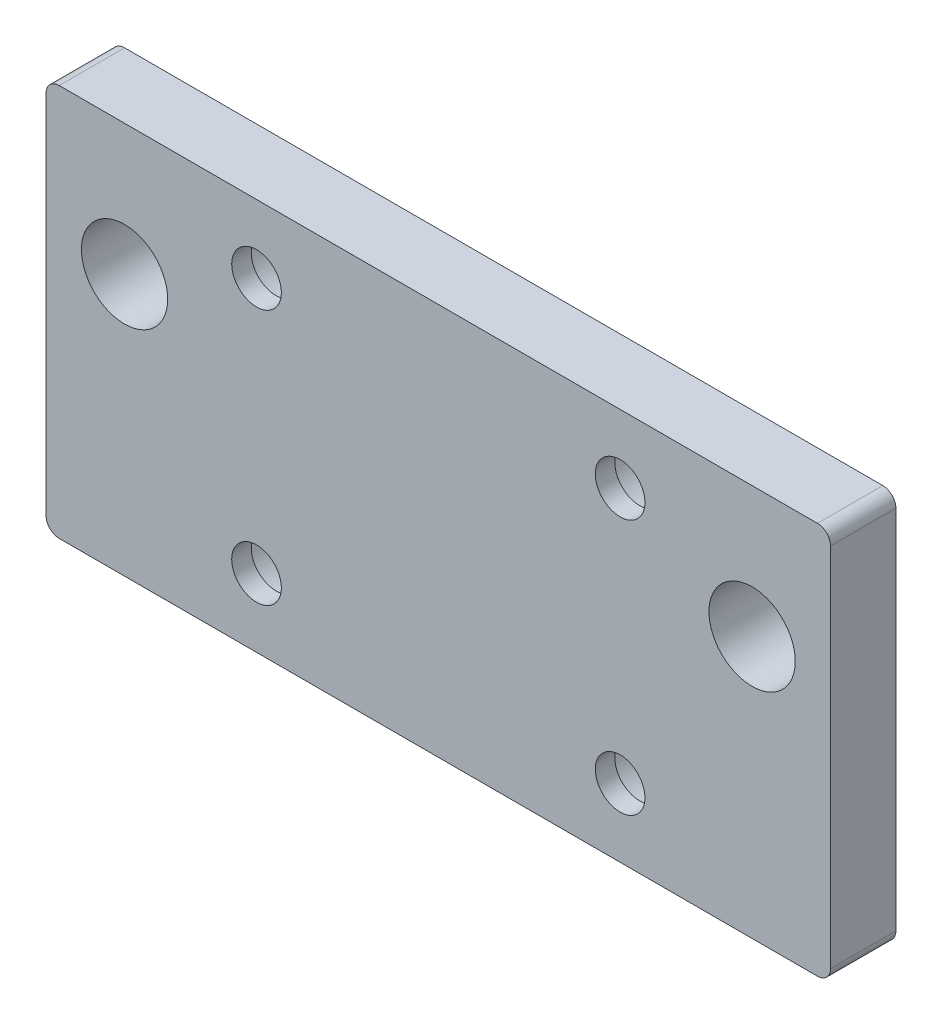
ISO-10303-21;
HEADER;
FILE_DESCRIPTION(('STEP AP214'),'2;1');
FILE_NAME('part.step','',(''),(''),'','','');
FILE_SCHEMA(('AUTOMOTIVE_DESIGN { 1 0 10303 214 1 1 1 1 }'));
ENDSEC;
DATA;
#1=APPLICATION_CONTEXT('core data for automotive mechanical design processes');
#2=APPLICATION_PROTOCOL_DEFINITION('international standard','automotive_design',2000,#1);
#3=PRODUCT_CONTEXT('',#1,'mechanical');
#4=PRODUCT('Part','Part','',(#3));
#5=PRODUCT_RELATED_PRODUCT_CATEGORY('part','',(#4));
#6=PRODUCT_DEFINITION_FORMATION('','',#4);
#7=PRODUCT_DEFINITION_CONTEXT('part definition',#1,'design');
#8=PRODUCT_DEFINITION('design','',#6,#7);
#9=PRODUCT_DEFINITION_SHAPE('','',#8);
#10=(LENGTH_UNIT() NAMED_UNIT(*) SI_UNIT(.MILLI.,.METRE.));
#11=(NAMED_UNIT(*) PLANE_ANGLE_UNIT() SI_UNIT($,.RADIAN.));
#12=(NAMED_UNIT(*) SI_UNIT($,.STERADIAN.) SOLID_ANGLE_UNIT());
#13=UNCERTAINTY_MEASURE_WITH_UNIT(LENGTH_MEASURE(1.E-05),#10,'distance_accuracy_value','');
#14=(GEOMETRIC_REPRESENTATION_CONTEXT(3) GLOBAL_UNCERTAINTY_ASSIGNED_CONTEXT((#13)) GLOBAL_UNIT_ASSIGNED_CONTEXT((#10,
#11,#12)) REPRESENTATION_CONTEXT('',''));
#15=CARTESIAN_POINT('',(0.,0.,0.));
#16=DIRECTION('',(0.,0.,1.));
#17=DIRECTION('',(1.,0.,0.));
#18=AXIS2_PLACEMENT_3D('',#15,#16,#17);
#19=CARTESIAN_POINT('',(0.,0.,5.));
#20=DIRECTION('',(1.,0.,0.));
#21=DIRECTION('',(0.,0.,-1.));
#22=AXIS2_PLACEMENT_3D('',#19,#20,#21);
#23=PLANE('',#22);
#24=DIRECTION('',(0.,-1.,0.));
#25=VECTOR('',#24,1.);
#26=CARTESIAN_POINT('',(0.,0.,0.));
#27=LINE('',#26,#25);
#28=CARTESIAN_POINT('',(0.,29.,0.));
#29=VERTEX_POINT('',#28);
#30=CARTESIAN_POINT('',(0.,1.,0.));
#31=VERTEX_POINT('',#30);
#32=EDGE_CURVE('E158',#29,#31,#27,.T.);
#33=ORIENTED_EDGE('',*,*,#32,.T.);
#34=DIRECTION('',(0.,0.,-1.));
#35=VECTOR('',#34,1.);
#36=CARTESIAN_POINT('',(0.,1.,5.));
#37=LINE('',#36,#35);
#38=CARTESIAN_POINT('',(0.,1.,5.));
#39=VERTEX_POINT('',#38);
#40=EDGE_CURVE('E11',#31,#39,#37,.F.);
#41=ORIENTED_EDGE('',*,*,#40,.T.);
#42=DIRECTION('',(0.,-1.,0.));
#43=VECTOR('',#42,1.);
#44=CARTESIAN_POINT('',(0.,0.,5.));
#45=LINE('',#44,#43);
#46=CARTESIAN_POINT('',(0.,29.,5.));
#47=VERTEX_POINT('',#46);
#48=EDGE_CURVE('E126',#47,#39,#45,.T.);
#49=ORIENTED_EDGE('',*,*,#48,.F.);
#50=DIRECTION('',(0.,0.,-1.));
#51=VECTOR('',#50,1.);
#52=CARTESIAN_POINT('',(0.,29.,5.));
#53=LINE('',#52,#51);
#54=EDGE_CURVE('E42',#47,#29,#53,.T.);
#55=ORIENTED_EDGE('',*,*,#54,.T.);
#56=EDGE_LOOP('',(#33,#41,#49,#55));
#57=FACE_BOUND('',#56,.T.);
#58=ADVANCED_FACE('F34',(#57),#23,.F.);
#59=CARTESIAN_POINT('',(0.,0.,5.));
#60=DIRECTION('',(0.,1.,0.));
#61=DIRECTION('',(0.,0.,1.));
#62=AXIS2_PLACEMENT_3D('',#59,#60,#61);
#63=PLANE('',#62);
#64=DIRECTION('',(1.,0.,0.));
#65=VECTOR('',#64,1.);
#66=CARTESIAN_POINT('',(0.,0.,0.));
#67=LINE('',#66,#65);
#68=CARTESIAN_POINT('',(1.,0.,0.));
#69=VERTEX_POINT('',#68);
#70=CARTESIAN_POINT('',(59.,0.,0.));
#71=VERTEX_POINT('',#70);
#72=EDGE_CURVE('E131',#69,#71,#67,.T.);
#73=ORIENTED_EDGE('',*,*,#72,.T.);
#74=DIRECTION('',(0.,0.,-1.));
#75=VECTOR('',#74,1.);
#76=CARTESIAN_POINT('',(59.,0.,5.));
#77=LINE('',#76,#75);
#78=CARTESIAN_POINT('',(59.,0.,5.));
#79=VERTEX_POINT('',#78);
#80=EDGE_CURVE('E49',#71,#79,#77,.F.);
#81=ORIENTED_EDGE('',*,*,#80,.T.);
#82=DIRECTION('',(1.,0.,0.));
#83=VECTOR('',#82,1.);
#84=CARTESIAN_POINT('',(0.,0.,5.));
#85=LINE('',#84,#83);
#86=CARTESIAN_POINT('',(1.,0.,5.));
#87=VERTEX_POINT('',#86);
#88=EDGE_CURVE('E129',#87,#79,#85,.T.);
#89=ORIENTED_EDGE('',*,*,#88,.F.);
#90=DIRECTION('',(0.,0.,-1.));
#91=VECTOR('',#90,1.);
#92=CARTESIAN_POINT('',(1.,0.,5.));
#93=LINE('',#92,#91);
#94=EDGE_CURVE('E150',#87,#69,#93,.T.);
#95=ORIENTED_EDGE('',*,*,#94,.T.);
#96=EDGE_LOOP('',(#73,#81,#89,#95));
#97=FACE_BOUND('',#96,.T.);
#98=ADVANCED_FACE('F259',(#97),#63,.F.);
#99=CARTESIAN_POINT('',(60.,0.,5.));
#100=DIRECTION('',(-1.,0.,0.));
#101=DIRECTION('',(0.,0.,1.));
#102=AXIS2_PLACEMENT_3D('',#99,#100,#101);
#103=PLANE('',#102);
#104=DIRECTION('',(0.,1.,0.));
#105=VECTOR('',#104,1.);
#106=CARTESIAN_POINT('',(60.,0.,0.));
#107=LINE('',#106,#105);
#108=CARTESIAN_POINT('',(60.,1.,0.));
#109=VERTEX_POINT('',#108);
#110=CARTESIAN_POINT('',(60.,29.,0.));
#111=VERTEX_POINT('',#110);
#112=EDGE_CURVE('E127',#109,#111,#107,.T.);
#113=ORIENTED_EDGE('',*,*,#112,.T.);
#114=DIRECTION('',(0.,0.,-1.));
#115=VECTOR('',#114,1.);
#116=CARTESIAN_POINT('',(60.,29.,5.));
#117=LINE('',#116,#115);
#118=CARTESIAN_POINT('',(60.,29.,5.));
#119=VERTEX_POINT('',#118);
#120=EDGE_CURVE('E105',#111,#119,#117,.F.);
#121=ORIENTED_EDGE('',*,*,#120,.T.);
#122=DIRECTION('',(0.,1.,0.));
#123=VECTOR('',#122,1.);
#124=CARTESIAN_POINT('',(60.,0.,5.));
#125=LINE('',#124,#123);
#126=CARTESIAN_POINT('',(60.,1.,5.));
#127=VERTEX_POINT('',#126);
#128=EDGE_CURVE('E170',#127,#119,#125,.T.);
#129=ORIENTED_EDGE('',*,*,#128,.F.);
#130=DIRECTION('',(0.,0.,-1.));
#131=VECTOR('',#130,1.);
#132=CARTESIAN_POINT('',(60.,1.,5.));
#133=LINE('',#132,#131);
#134=EDGE_CURVE('E110',#127,#109,#133,.T.);
#135=ORIENTED_EDGE('',*,*,#134,.T.);
#136=EDGE_LOOP('',(#113,#121,#129,#135));
#137=FACE_BOUND('',#136,.T.);
#138=ADVANCED_FACE('F264',(#137),#103,.F.);
#139=CARTESIAN_POINT('',(0.,30.,5.));
#140=DIRECTION('',(0.,-1.,0.));
#141=DIRECTION('',(0.,0.,-1.));
#142=AXIS2_PLACEMENT_3D('',#139,#140,#141);
#143=PLANE('',#142);
#144=DIRECTION('',(-1.,0.,0.));
#145=VECTOR('',#144,1.);
#146=CARTESIAN_POINT('',(0.,30.,5.));
#147=LINE('',#146,#145);
#148=CARTESIAN_POINT('',(59.,30.,5.));
#149=VERTEX_POINT('',#148);
#150=CARTESIAN_POINT('',(1.,30.,5.));
#151=VERTEX_POINT('',#150);
#152=EDGE_CURVE('E120',#149,#151,#147,.T.);
#153=ORIENTED_EDGE('',*,*,#152,.F.);
#154=DIRECTION('',(0.,0.,-1.));
#155=VECTOR('',#154,1.);
#156=CARTESIAN_POINT('',(59.,30.,5.));
#157=LINE('',#156,#155);
#158=CARTESIAN_POINT('',(59.,30.,0.));
#159=VERTEX_POINT('',#158);
#160=EDGE_CURVE('E104',#149,#159,#157,.T.);
#161=ORIENTED_EDGE('',*,*,#160,.T.);
#162=DIRECTION('',(-1.,0.,0.));
#163=VECTOR('',#162,1.);
#164=CARTESIAN_POINT('',(0.,30.,0.));
#165=LINE('',#164,#163);
#166=CARTESIAN_POINT('',(1.,30.,0.));
#167=VERTEX_POINT('',#166);
#168=EDGE_CURVE('E117',#159,#167,#165,.T.);
#169=ORIENTED_EDGE('',*,*,#168,.T.);
#170=DIRECTION('',(0.,0.,-1.));
#171=VECTOR('',#170,1.);
#172=CARTESIAN_POINT('',(1.,30.,5.));
#173=LINE('',#172,#171);
#174=EDGE_CURVE('E122',#167,#151,#173,.F.);
#175=ORIENTED_EDGE('',*,*,#174,.T.);
#176=EDGE_LOOP('',(#153,#161,#169,#175));
#177=FACE_BOUND('',#176,.T.);
#178=ADVANCED_FACE('F116',(#177),#143,.F.);
#179=CARTESIAN_POINT('',(0.,0.,5.));
#180=DIRECTION('',(0.,0.,-1.));
#181=DIRECTION('',(-1.,0.,0.));
#182=AXIS2_PLACEMENT_3D('',#179,#180,#181);
#183=PLANE('',#182);
#184=CARTESIAN_POINT('',(43.9054999999983,24.779,5.));
#185=DIRECTION('',(0.,0.,-1.));
#186=DIRECTION('',(-1.,0.,0.));
#187=AXIS2_PLACEMENT_3D('',#184,#185,#186);
#188=CIRCLE('',#187,1.89865);
#189=CARTESIAN_POINT('',(42.0068499999983,24.779,5.));
#190=VERTEX_POINT('',#189);
#191=EDGE_CURVE('E218',#190,#190,#188,.T.);
#192=ORIENTED_EDGE('',*,*,#191,.T.);
#193=EDGE_LOOP('',(#192));
#194=FACE_BOUND('',#193,.T.);
#195=CARTESIAN_POINT('',(16.0944999999982,24.779,5.));
#196=DIRECTION('',(0.,0.,-1.));
#197=DIRECTION('',(-1.,0.,0.));
#198=AXIS2_PLACEMENT_3D('',#195,#196,#197);
#199=CIRCLE('',#198,1.89865);
#200=CARTESIAN_POINT('',(14.1958499999982,24.779,5.));
#201=VERTEX_POINT('',#200);
#202=EDGE_CURVE('E206',#201,#201,#199,.T.);
#203=ORIENTED_EDGE('',*,*,#202,.T.);
#204=EDGE_LOOP('',(#203));
#205=FACE_BOUND('',#204,.T.);
#206=CARTESIAN_POINT('',(43.9054999999983,5.22099999999998,5.));
#207=DIRECTION('',(0.,0.,-1.));
#208=DIRECTION('',(-1.,0.,0.));
#209=AXIS2_PLACEMENT_3D('',#206,#207,#208);
#210=CIRCLE('',#209,1.89865);
#211=CARTESIAN_POINT('',(42.0068499999983,5.22099999999998,5.));
#212=VERTEX_POINT('',#211);
#213=EDGE_CURVE('E194',#212,#212,#210,.T.);
#214=ORIENTED_EDGE('',*,*,#213,.T.);
#215=EDGE_LOOP('',(#214));
#216=FACE_BOUND('',#215,.T.);
#217=CARTESIAN_POINT('',(16.0944999999982,5.221,5.));
#218=DIRECTION('',(0.,0.,-1.));
#219=DIRECTION('',(-1.,0.,0.));
#220=AXIS2_PLACEMENT_3D('',#217,#218,#219);
#221=CIRCLE('',#220,1.89865);
#222=CARTESIAN_POINT('',(14.1958499999982,5.221,5.));
#223=VERTEX_POINT('',#222);
#224=EDGE_CURVE('E182',#223,#223,#221,.T.);
#225=ORIENTED_EDGE('',*,*,#224,.T.);
#226=EDGE_LOOP('',(#225));
#227=FACE_BOUND('',#226,.T.);
#228=CARTESIAN_POINT('',(6.,20.,5.));
#229=DIRECTION('',(0.,0.,1.));
#230=DIRECTION('',(1.,0.,0.));
#231=AXIS2_PLACEMENT_3D('',#228,#229,#230);
#232=CIRCLE('',#231,3.3);
#233=CARTESIAN_POINT('',(9.3,20.,5.));
#234=VERTEX_POINT('',#233);
#235=EDGE_CURVE('E179',#234,#234,#232,.T.);
#236=ORIENTED_EDGE('',*,*,#235,.F.);
#237=EDGE_LOOP('',(#236));
#238=FACE_BOUND('',#237,.T.);
#239=CARTESIAN_POINT('',(54.,20.,5.));
#240=DIRECTION('',(0.,0.,1.));
#241=DIRECTION('',(1.,0.,0.));
#242=AXIS2_PLACEMENT_3D('',#239,#240,#241);
#243=CIRCLE('',#242,3.3);
#244=CARTESIAN_POINT('',(57.3,20.,5.));
#245=VERTEX_POINT('',#244);
#246=EDGE_CURVE('E166',#245,#245,#243,.T.);
#247=ORIENTED_EDGE('',*,*,#246,.F.);
#248=EDGE_LOOP('',(#247));
#249=FACE_BOUND('',#248,.T.);
#250=ORIENTED_EDGE('',*,*,#128,.T.);
#251=CARTESIAN_POINT('',(59.,29.,5.));
#252=DIRECTION('',(0.,0.,-1.));
#253=DIRECTION('',(-1.,0.,0.));
#254=AXIS2_PLACEMENT_3D('',#251,#252,#253);
#255=CIRCLE('',#254,1.);
#256=EDGE_CURVE('E148',#119,#149,#255,.F.);
#257=ORIENTED_EDGE('',*,*,#256,.T.);
#258=ORIENTED_EDGE('',*,*,#152,.T.);
#259=CARTESIAN_POINT('',(1.,29.,5.));
#260=DIRECTION('',(0.,0.,-1.));
#261=DIRECTION('',(-1.,0.,0.));
#262=AXIS2_PLACEMENT_3D('',#259,#260,#261);
#263=CIRCLE('',#262,1.);
#264=EDGE_CURVE('E143',#151,#47,#263,.F.);
#265=ORIENTED_EDGE('',*,*,#264,.T.);
#266=ORIENTED_EDGE('',*,*,#48,.T.);
#267=CARTESIAN_POINT('',(1.,1.,5.));
#268=DIRECTION('',(0.,0.,-1.));
#269=DIRECTION('',(-1.,0.,0.));
#270=AXIS2_PLACEMENT_3D('',#267,#268,#269);
#271=CIRCLE('',#270,1.);
#272=EDGE_CURVE('E56',#39,#87,#271,.F.);
#273=ORIENTED_EDGE('',*,*,#272,.T.);
#274=ORIENTED_EDGE('',*,*,#88,.T.);
#275=CARTESIAN_POINT('',(59.,1.,5.));
#276=DIRECTION('',(0.,0.,-1.));
#277=DIRECTION('',(-1.,0.,0.));
#278=AXIS2_PLACEMENT_3D('',#275,#276,#277);
#279=CIRCLE('',#278,1.);
#280=EDGE_CURVE('E146',#79,#127,#279,.F.);
#281=ORIENTED_EDGE('',*,*,#280,.T.);
#282=EDGE_LOOP('',(#250,#257,#258,#265,#266,#273,#274,#281));
#283=FACE_BOUND('',#282,.T.);
#284=ADVANCED_FACE('F236',(#194,#205,#216,#227,#238,#249,#283),#183,.F.);
#285=CARTESIAN_POINT('',(0.,0.,0.));
#286=DIRECTION('',(0.,0.,-1.));
#287=DIRECTION('',(-1.,0.,0.));
#288=AXIS2_PLACEMENT_3D('',#285,#286,#287);
#289=PLANE('',#288);
#290=CARTESIAN_POINT('',(43.9054999999983,24.779,0.));
#291=DIRECTION('',(0.,0.,-1.));
#292=DIRECTION('',(-1.,0.,0.));
#293=AXIS2_PLACEMENT_3D('',#290,#291,#292);
#294=CIRCLE('',#293,3.57251);
#295=CARTESIAN_POINT('',(40.3329899999983,24.779,0.));
#296=VERTEX_POINT('',#295);
#297=EDGE_CURVE('E227',#296,#296,#294,.T.);
#298=ORIENTED_EDGE('',*,*,#297,.F.);
#299=EDGE_LOOP('',(#298));
#300=FACE_BOUND('',#299,.T.);
#301=CARTESIAN_POINT('',(16.0944999999982,24.779,0.));
#302=DIRECTION('',(0.,0.,-1.));
#303=DIRECTION('',(-1.,0.,0.));
#304=AXIS2_PLACEMENT_3D('',#301,#302,#303);
#305=CIRCLE('',#304,3.57251);
#306=CARTESIAN_POINT('',(12.5219899999982,24.779,0.));
#307=VERTEX_POINT('',#306);
#308=EDGE_CURVE('E215',#307,#307,#305,.T.);
#309=ORIENTED_EDGE('',*,*,#308,.F.);
#310=EDGE_LOOP('',(#309));
#311=FACE_BOUND('',#310,.T.);
#312=CARTESIAN_POINT('',(43.9054999999983,5.22099999999998,0.));
#313=DIRECTION('',(0.,0.,-1.));
#314=DIRECTION('',(-1.,0.,0.));
#315=AXIS2_PLACEMENT_3D('',#312,#313,#314);
#316=CIRCLE('',#315,3.57251);
#317=CARTESIAN_POINT('',(40.3329899999983,5.22099999999998,0.));
#318=VERTEX_POINT('',#317);
#319=EDGE_CURVE('E203',#318,#318,#316,.T.);
#320=ORIENTED_EDGE('',*,*,#319,.F.);
#321=EDGE_LOOP('',(#320));
#322=FACE_BOUND('',#321,.T.);
#323=CARTESIAN_POINT('',(16.0944999999982,5.221,0.));
#324=DIRECTION('',(0.,0.,-1.));
#325=DIRECTION('',(-1.,0.,0.));
#326=AXIS2_PLACEMENT_3D('',#323,#324,#325);
#327=CIRCLE('',#326,3.57251);
#328=CARTESIAN_POINT('',(12.5219899999982,5.221,0.));
#329=VERTEX_POINT('',#328);
#330=EDGE_CURVE('E191',#329,#329,#327,.T.);
#331=ORIENTED_EDGE('',*,*,#330,.F.);
#332=EDGE_LOOP('',(#331));
#333=FACE_BOUND('',#332,.T.);
#334=CARTESIAN_POINT('',(6.,20.,0.));
#335=DIRECTION('',(0.,0.,-1.));
#336=DIRECTION('',(-1.,0.,0.));
#337=AXIS2_PLACEMENT_3D('',#334,#335,#336);
#338=CIRCLE('',#337,3.3);
#339=CARTESIAN_POINT('',(2.7,20.,0.));
#340=VERTEX_POINT('',#339);
#341=EDGE_CURVE('E176',#340,#340,#338,.T.);
#342=ORIENTED_EDGE('',*,*,#341,.F.);
#343=EDGE_LOOP('',(#342));
#344=FACE_BOUND('',#343,.T.);
#345=CARTESIAN_POINT('',(54.,20.,0.));
#346=DIRECTION('',(0.,0.,-1.));
#347=DIRECTION('',(-1.,0.,0.));
#348=AXIS2_PLACEMENT_3D('',#345,#346,#347);
#349=CIRCLE('',#348,3.3);
#350=CARTESIAN_POINT('',(50.7,20.,0.));
#351=VERTEX_POINT('',#350);
#352=EDGE_CURVE('E163',#351,#351,#349,.T.);
#353=ORIENTED_EDGE('',*,*,#352,.F.);
#354=EDGE_LOOP('',(#353));
#355=FACE_BOUND('',#354,.T.);
#356=ORIENTED_EDGE('',*,*,#168,.F.);
#357=CARTESIAN_POINT('',(59.,29.,0.));
#358=DIRECTION('',(0.,0.,-1.));
#359=DIRECTION('',(-1.,0.,0.));
#360=AXIS2_PLACEMENT_3D('',#357,#358,#359);
#361=CIRCLE('',#360,1.);
#362=EDGE_CURVE('E100',#159,#111,#361,.T.);
#363=ORIENTED_EDGE('',*,*,#362,.T.);
#364=ORIENTED_EDGE('',*,*,#112,.F.);
#365=CARTESIAN_POINT('',(59.,1.,0.));
#366=DIRECTION('',(0.,0.,-1.));
#367=DIRECTION('',(-1.,0.,0.));
#368=AXIS2_PLACEMENT_3D('',#365,#366,#367);
#369=CIRCLE('',#368,1.);
#370=EDGE_CURVE('E111',#109,#71,#369,.T.);
#371=ORIENTED_EDGE('',*,*,#370,.T.);
#372=ORIENTED_EDGE('',*,*,#72,.F.);
#373=CARTESIAN_POINT('',(1.,1.,0.));
#374=DIRECTION('',(0.,0.,-1.));
#375=DIRECTION('',(-1.,0.,0.));
#376=AXIS2_PLACEMENT_3D('',#373,#374,#375);
#377=CIRCLE('',#376,1.);
#378=EDGE_CURVE('E137',#69,#31,#377,.T.);
#379=ORIENTED_EDGE('',*,*,#378,.T.);
#380=ORIENTED_EDGE('',*,*,#32,.F.);
#381=CARTESIAN_POINT('',(1.,29.,0.));
#382=DIRECTION('',(0.,0.,-1.));
#383=DIRECTION('',(-1.,0.,0.));
#384=AXIS2_PLACEMENT_3D('',#381,#382,#383);
#385=CIRCLE('',#384,1.);
#386=EDGE_CURVE('E121',#29,#167,#385,.T.);
#387=ORIENTED_EDGE('',*,*,#386,.T.);
#388=EDGE_LOOP('',(#356,#363,#364,#371,#372,#379,#380,#387));
#389=FACE_BOUND('',#388,.T.);
#390=ADVANCED_FACE('F124',(#300,#311,#322,#333,#344,#355,#389),#289,.T.);
#391=CARTESIAN_POINT('',(54.,20.,5.));
#392=DIRECTION('',(0.,0.,1.));
#393=DIRECTION('',(1.,0.,0.));
#394=AXIS2_PLACEMENT_3D('',#391,#392,#393);
#395=CYLINDRICAL_SURFACE('',#394,3.3);
#396=ORIENTED_EDGE('',*,*,#246,.T.);
#397=EDGE_LOOP('',(#396));
#398=FACE_BOUND('',#397,.T.);
#399=ORIENTED_EDGE('',*,*,#352,.T.);
#400=EDGE_LOOP('',(#399));
#401=FACE_BOUND('',#400,.T.);
#402=ADVANCED_FACE('F235',(#398,#401),#395,.F.);
#403=CARTESIAN_POINT('',(6.,20.,5.));
#404=DIRECTION('',(0.,0.,1.));
#405=DIRECTION('',(1.,0.,0.));
#406=AXIS2_PLACEMENT_3D('',#403,#404,#405);
#407=CYLINDRICAL_SURFACE('',#406,3.3);
#408=ORIENTED_EDGE('',*,*,#235,.T.);
#409=EDGE_LOOP('',(#408));
#410=FACE_BOUND('',#409,.T.);
#411=ORIENTED_EDGE('',*,*,#341,.T.);
#412=EDGE_LOOP('',(#411));
#413=FACE_BOUND('',#412,.T.);
#414=ADVANCED_FACE('F249',(#410,#413),#407,.F.);
#415=CARTESIAN_POINT('',(59.,29.,5.));
#416=DIRECTION('',(0.,0.,-1.));
#417=DIRECTION('',(-1.,0.,0.));
#418=AXIS2_PLACEMENT_3D('',#415,#416,#417);
#419=CYLINDRICAL_SURFACE('',#418,1.);
#420=ORIENTED_EDGE('',*,*,#256,.F.);
#421=ORIENTED_EDGE('',*,*,#120,.F.);
#422=ORIENTED_EDGE('',*,*,#362,.F.);
#423=ORIENTED_EDGE('',*,*,#160,.F.);
#424=EDGE_LOOP('',(#420,#421,#422,#423));
#425=FACE_BOUND('',#424,.T.);
#426=ADVANCED_FACE('F103',(#425),#419,.T.);
#427=CARTESIAN_POINT('',(59.,1.,5.));
#428=DIRECTION('',(0.,0.,-1.));
#429=DIRECTION('',(-1.,0.,0.));
#430=AXIS2_PLACEMENT_3D('',#427,#428,#429);
#431=CYLINDRICAL_SURFACE('',#430,1.);
#432=ORIENTED_EDGE('',*,*,#280,.F.);
#433=ORIENTED_EDGE('',*,*,#80,.F.);
#434=ORIENTED_EDGE('',*,*,#370,.F.);
#435=ORIENTED_EDGE('',*,*,#134,.F.);
#436=EDGE_LOOP('',(#432,#433,#434,#435));
#437=FACE_BOUND('',#436,.T.);
#438=ADVANCED_FACE('F270',(#437),#431,.T.);
#439=CARTESIAN_POINT('',(1.,1.,5.));
#440=DIRECTION('',(0.,0.,-1.));
#441=DIRECTION('',(-1.,0.,0.));
#442=AXIS2_PLACEMENT_3D('',#439,#440,#441);
#443=CYLINDRICAL_SURFACE('',#442,1.);
#444=ORIENTED_EDGE('',*,*,#272,.F.);
#445=ORIENTED_EDGE('',*,*,#40,.F.);
#446=ORIENTED_EDGE('',*,*,#378,.F.);
#447=ORIENTED_EDGE('',*,*,#94,.F.);
#448=EDGE_LOOP('',(#444,#445,#446,#447));
#449=FACE_BOUND('',#448,.T.);
#450=ADVANCED_FACE('F272',(#449),#443,.T.);
#451=CARTESIAN_POINT('',(1.,29.,5.));
#452=DIRECTION('',(0.,0.,-1.));
#453=DIRECTION('',(-1.,0.,0.));
#454=AXIS2_PLACEMENT_3D('',#451,#452,#453);
#455=CYLINDRICAL_SURFACE('',#454,1.);
#456=ORIENTED_EDGE('',*,*,#264,.F.);
#457=ORIENTED_EDGE('',*,*,#174,.F.);
#458=ORIENTED_EDGE('',*,*,#386,.F.);
#459=ORIENTED_EDGE('',*,*,#54,.F.);
#460=EDGE_LOOP('',(#456,#457,#458,#459));
#461=FACE_BOUND('',#460,.T.);
#462=ADVANCED_FACE('F36',(#461),#455,.T.);
#463=CARTESIAN_POINT('',(16.0944999999982,5.221,0.));
#464=DIRECTION('',(0.,0.,-1.));
#465=DIRECTION('',(-1.,0.,0.));
#466=AXIS2_PLACEMENT_3D('',#463,#464,#465);
#467=CYLINDRICAL_SURFACE('',#466,1.89865);
#468=ORIENTED_EDGE('',*,*,#224,.F.);
#469=EDGE_LOOP('',(#468));
#470=FACE_BOUND('',#469,.T.);
#471=CARTESIAN_POINT('',(16.0944999999982,5.221,3.5052));
#472=DIRECTION('',(0.,0.,-1.));
#473=DIRECTION('',(-1.,0.,0.));
#474=AXIS2_PLACEMENT_3D('',#471,#472,#473);
#475=CIRCLE('',#474,1.89865);
#476=CARTESIAN_POINT('',(14.1958499999982,5.221,3.5052));
#477=VERTEX_POINT('',#476);
#478=EDGE_CURVE('E185',#477,#477,#475,.T.);
#479=ORIENTED_EDGE('',*,*,#478,.T.);
#480=EDGE_LOOP('',(#479));
#481=FACE_BOUND('',#480,.T.);
#482=ADVANCED_FACE('F279',(#470,#481),#467,.F.);
#483=CARTESIAN_POINT('',(17.9931499999982,5.221,3.5052));
#484=DIRECTION('',(0.,0.,1.));
#485=DIRECTION('',(1.,0.,0.));
#486=AXIS2_PLACEMENT_3D('',#483,#484,#485);
#487=PLANE('',#486);
#488=ORIENTED_EDGE('',*,*,#478,.F.);
#489=EDGE_LOOP('',(#488));
#490=FACE_BOUND('',#489,.T.);
#491=CARTESIAN_POINT('',(16.0944999999982,5.221,3.5052));
#492=DIRECTION('',(0.,0.,-1.));
#493=DIRECTION('',(-1.,0.,0.));
#494=AXIS2_PLACEMENT_3D('',#491,#492,#493);
#495=CIRCLE('',#494,3.57251);
#496=CARTESIAN_POINT('',(12.5219899999982,5.221,3.5052));
#497=VERTEX_POINT('',#496);
#498=EDGE_CURVE('E188',#497,#497,#495,.T.);
#499=ORIENTED_EDGE('',*,*,#498,.T.);
#500=EDGE_LOOP('',(#499));
#501=FACE_BOUND('',#500,.T.);
#502=ADVANCED_FACE('F346',(#490,#501),#487,.F.);
#503=CARTESIAN_POINT('',(16.0944999999982,5.221,0.));
#504=DIRECTION('',(0.,0.,-1.));
#505=DIRECTION('',(-1.,0.,0.));
#506=AXIS2_PLACEMENT_3D('',#503,#504,#505);
#507=CYLINDRICAL_SURFACE('',#506,3.57251);
#508=ORIENTED_EDGE('',*,*,#498,.F.);
#509=EDGE_LOOP('',(#508));
#510=FACE_BOUND('',#509,.T.);
#511=ORIENTED_EDGE('',*,*,#330,.T.);
#512=EDGE_LOOP('',(#511));
#513=FACE_BOUND('',#512,.T.);
#514=ADVANCED_FACE('F356',(#510,#513),#507,.F.);
#515=CARTESIAN_POINT('',(43.9054999999983,5.22099999999998,0.));
#516=DIRECTION('',(0.,0.,-1.));
#517=DIRECTION('',(-1.,0.,0.));
#518=AXIS2_PLACEMENT_3D('',#515,#516,#517);
#519=CYLINDRICAL_SURFACE('',#518,1.89865);
#520=ORIENTED_EDGE('',*,*,#213,.F.);
#521=EDGE_LOOP('',(#520));
#522=FACE_BOUND('',#521,.T.);
#523=CARTESIAN_POINT('',(43.9054999999983,5.22099999999998,3.5052));
#524=DIRECTION('',(0.,0.,-1.));
#525=DIRECTION('',(-1.,0.,0.));
#526=AXIS2_PLACEMENT_3D('',#523,#524,#525);
#527=CIRCLE('',#526,1.89865);
#528=CARTESIAN_POINT('',(42.0068499999983,5.22099999999998,3.5052));
#529=VERTEX_POINT('',#528);
#530=EDGE_CURVE('E197',#529,#529,#527,.T.);
#531=ORIENTED_EDGE('',*,*,#530,.T.);
#532=EDGE_LOOP('',(#531));
#533=FACE_BOUND('',#532,.T.);
#534=ADVANCED_FACE('F366',(#522,#533),#519,.F.);
#535=CARTESIAN_POINT('',(45.8041499999983,5.22099999999998,3.5052));
#536=DIRECTION('',(0.,0.,1.));
#537=DIRECTION('',(1.,0.,0.));
#538=AXIS2_PLACEMENT_3D('',#535,#536,#537);
#539=PLANE('',#538);
#540=ORIENTED_EDGE('',*,*,#530,.F.);
#541=EDGE_LOOP('',(#540));
#542=FACE_BOUND('',#541,.T.);
#543=CARTESIAN_POINT('',(43.9054999999983,5.22099999999998,3.5052));
#544=DIRECTION('',(0.,0.,-1.));
#545=DIRECTION('',(-1.,0.,0.));
#546=AXIS2_PLACEMENT_3D('',#543,#544,#545);
#547=CIRCLE('',#546,3.57251);
#548=CARTESIAN_POINT('',(40.3329899999983,5.22099999999998,3.5052));
#549=VERTEX_POINT('',#548);
#550=EDGE_CURVE('E200',#549,#549,#547,.T.);
#551=ORIENTED_EDGE('',*,*,#550,.T.);
#552=EDGE_LOOP('',(#551));
#553=FACE_BOUND('',#552,.T.);
#554=ADVANCED_FACE('F376',(#542,#553),#539,.F.);
#555=CARTESIAN_POINT('',(43.9054999999983,5.22099999999998,0.));
#556=DIRECTION('',(0.,0.,-1.));
#557=DIRECTION('',(-1.,0.,0.));
#558=AXIS2_PLACEMENT_3D('',#555,#556,#557);
#559=CYLINDRICAL_SURFACE('',#558,3.57251);
#560=ORIENTED_EDGE('',*,*,#550,.F.);
#561=EDGE_LOOP('',(#560));
#562=FACE_BOUND('',#561,.T.);
#563=ORIENTED_EDGE('',*,*,#319,.T.);
#564=EDGE_LOOP('',(#563));
#565=FACE_BOUND('',#564,.T.);
#566=ADVANCED_FACE('F386',(#562,#565),#559,.F.);
#567=CARTESIAN_POINT('',(16.0944999999982,24.779,0.));
#568=DIRECTION('',(0.,0.,-1.));
#569=DIRECTION('',(-1.,0.,0.));
#570=AXIS2_PLACEMENT_3D('',#567,#568,#569);
#571=CYLINDRICAL_SURFACE('',#570,1.89865);
#572=ORIENTED_EDGE('',*,*,#202,.F.);
#573=EDGE_LOOP('',(#572));
#574=FACE_BOUND('',#573,.T.);
#575=CARTESIAN_POINT('',(16.0944999999982,24.779,3.5052));
#576=DIRECTION('',(0.,0.,-1.));
#577=DIRECTION('',(-1.,0.,0.));
#578=AXIS2_PLACEMENT_3D('',#575,#576,#577);
#579=CIRCLE('',#578,1.89865);
#580=CARTESIAN_POINT('',(14.1958499999982,24.779,3.5052));
#581=VERTEX_POINT('',#580);
#582=EDGE_CURVE('E209',#581,#581,#579,.T.);
#583=ORIENTED_EDGE('',*,*,#582,.T.);
#584=EDGE_LOOP('',(#583));
#585=FACE_BOUND('',#584,.T.);
#586=ADVANCED_FACE('F396',(#574,#585),#571,.F.);
#587=CARTESIAN_POINT('',(17.9931499999982,24.779,3.5052));
#588=DIRECTION('',(0.,0.,1.));
#589=DIRECTION('',(1.,0.,0.));
#590=AXIS2_PLACEMENT_3D('',#587,#588,#589);
#591=PLANE('',#590);
#592=ORIENTED_EDGE('',*,*,#582,.F.);
#593=EDGE_LOOP('',(#592));
#594=FACE_BOUND('',#593,.T.);
#595=CARTESIAN_POINT('',(16.0944999999982,24.779,3.5052));
#596=DIRECTION('',(0.,0.,-1.));
#597=DIRECTION('',(-1.,0.,0.));
#598=AXIS2_PLACEMENT_3D('',#595,#596,#597);
#599=CIRCLE('',#598,3.57251);
#600=CARTESIAN_POINT('',(12.5219899999982,24.779,3.5052));
#601=VERTEX_POINT('',#600);
#602=EDGE_CURVE('E212',#601,#601,#599,.T.);
#603=ORIENTED_EDGE('',*,*,#602,.T.);
#604=EDGE_LOOP('',(#603));
#605=FACE_BOUND('',#604,.T.);
#606=ADVANCED_FACE('F406',(#594,#605),#591,.F.);
#607=CARTESIAN_POINT('',(16.0944999999982,24.779,0.));
#608=DIRECTION('',(0.,0.,-1.));
#609=DIRECTION('',(-1.,0.,0.));
#610=AXIS2_PLACEMENT_3D('',#607,#608,#609);
#611=CYLINDRICAL_SURFACE('',#610,3.57251);
#612=ORIENTED_EDGE('',*,*,#602,.F.);
#613=EDGE_LOOP('',(#612));
#614=FACE_BOUND('',#613,.T.);
#615=ORIENTED_EDGE('',*,*,#308,.T.);
#616=EDGE_LOOP('',(#615));
#617=FACE_BOUND('',#616,.T.);
#618=ADVANCED_FACE('F416',(#614,#617),#611,.F.);
#619=CARTESIAN_POINT('',(43.9054999999983,24.779,0.));
#620=DIRECTION('',(0.,0.,-1.));
#621=DIRECTION('',(-1.,0.,0.));
#622=AXIS2_PLACEMENT_3D('',#619,#620,#621);
#623=CYLINDRICAL_SURFACE('',#622,1.89865);
#624=ORIENTED_EDGE('',*,*,#191,.F.);
#625=EDGE_LOOP('',(#624));
#626=FACE_BOUND('',#625,.T.);
#627=CARTESIAN_POINT('',(43.9054999999983,24.779,3.5052));
#628=DIRECTION('',(0.,0.,-1.));
#629=DIRECTION('',(-1.,0.,0.));
#630=AXIS2_PLACEMENT_3D('',#627,#628,#629);
#631=CIRCLE('',#630,1.89865);
#632=CARTESIAN_POINT('',(42.0068499999983,24.779,3.5052));
#633=VERTEX_POINT('',#632);
#634=EDGE_CURVE('E221',#633,#633,#631,.T.);
#635=ORIENTED_EDGE('',*,*,#634,.T.);
#636=EDGE_LOOP('',(#635));
#637=FACE_BOUND('',#636,.T.);
#638=ADVANCED_FACE('F426',(#626,#637),#623,.F.);
#639=CARTESIAN_POINT('',(45.8041499999983,24.779,3.5052));
#640=DIRECTION('',(0.,0.,1.));
#641=DIRECTION('',(1.,0.,0.));
#642=AXIS2_PLACEMENT_3D('',#639,#640,#641);
#643=PLANE('',#642);
#644=ORIENTED_EDGE('',*,*,#634,.F.);
#645=EDGE_LOOP('',(#644));
#646=FACE_BOUND('',#645,.T.);
#647=CARTESIAN_POINT('',(43.9054999999983,24.779,3.5052));
#648=DIRECTION('',(0.,0.,-1.));
#649=DIRECTION('',(-1.,0.,0.));
#650=AXIS2_PLACEMENT_3D('',#647,#648,#649);
#651=CIRCLE('',#650,3.57251);
#652=CARTESIAN_POINT('',(40.3329899999983,24.779,3.5052));
#653=VERTEX_POINT('',#652);
#654=EDGE_CURVE('E224',#653,#653,#651,.T.);
#655=ORIENTED_EDGE('',*,*,#654,.T.);
#656=EDGE_LOOP('',(#655));
#657=FACE_BOUND('',#656,.T.);
#658=ADVANCED_FACE('F436',(#646,#657),#643,.F.);
#659=CARTESIAN_POINT('',(43.9054999999983,24.779,0.));
#660=DIRECTION('',(0.,0.,-1.));
#661=DIRECTION('',(-1.,0.,0.));
#662=AXIS2_PLACEMENT_3D('',#659,#660,#661);
#663=CYLINDRICAL_SURFACE('',#662,3.57251);
#664=ORIENTED_EDGE('',*,*,#654,.F.);
#665=EDGE_LOOP('',(#664));
#666=FACE_BOUND('',#665,.T.);
#667=ORIENTED_EDGE('',*,*,#297,.T.);
#668=EDGE_LOOP('',(#667));
#669=FACE_BOUND('',#668,.T.);
#670=ADVANCED_FACE('F231',(#666,#669),#663,.F.);
#671=CLOSED_SHELL('',(#58,#98,#138,#178,#284,#390,#402,#414,#426,#438,#450,#462,#482,#502,#514,
#534,#554,#566,#586,#606,#618,#638,#658,#670));
#672=MANIFOLD_SOLID_BREP('B2',#671);
#673=ADVANCED_BREP_SHAPE_REPRESENTATION('',(#18,#672),#14);
#674=SHAPE_DEFINITION_REPRESENTATION(#9,#673);
ENDSEC;
END-ISO-10303-21;
